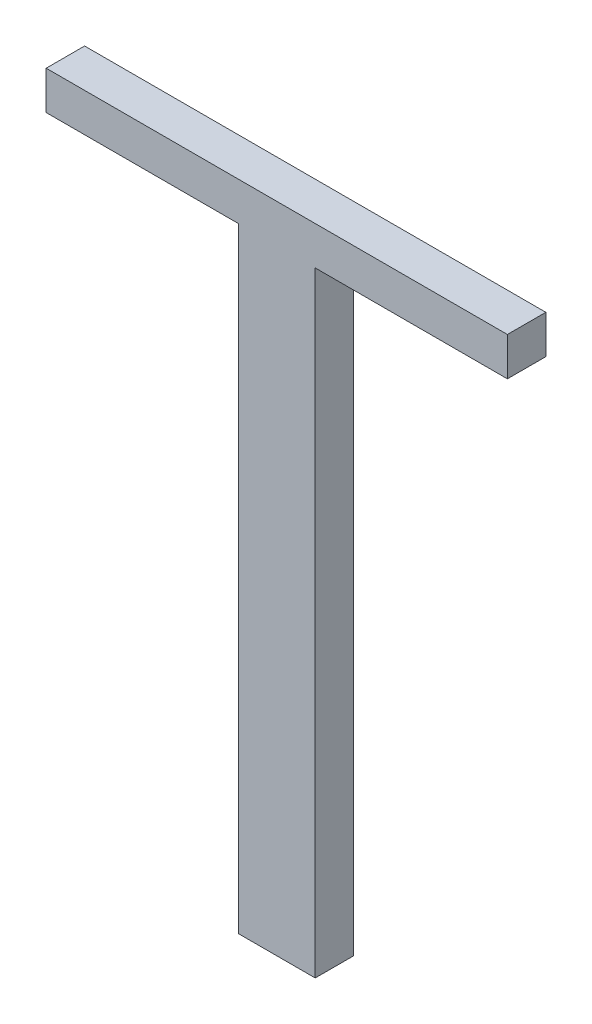
ISO-10303-21;
HEADER;
FILE_DESCRIPTION(('STEP AP214'),'2;1');
FILE_NAME('part.step','',(''),(''),'','','');
FILE_SCHEMA(('AUTOMOTIVE_DESIGN { 1 0 10303 214 1 1 1 1 }'));
ENDSEC;
DATA;
#1=APPLICATION_CONTEXT('core data for automotive mechanical design processes');
#2=APPLICATION_PROTOCOL_DEFINITION('international standard','automotive_design',2000,#1);
#3=PRODUCT_CONTEXT('',#1,'mechanical');
#4=PRODUCT('Part','Part','',(#3));
#5=PRODUCT_RELATED_PRODUCT_CATEGORY('part','',(#4));
#6=PRODUCT_DEFINITION_FORMATION('','',#4);
#7=PRODUCT_DEFINITION_CONTEXT('part definition',#1,'design');
#8=PRODUCT_DEFINITION('design','',#6,#7);
#9=PRODUCT_DEFINITION_SHAPE('','',#8);
#10=(LENGTH_UNIT() NAMED_UNIT(*) SI_UNIT(.MILLI.,.METRE.));
#11=(NAMED_UNIT(*) PLANE_ANGLE_UNIT() SI_UNIT($,.RADIAN.));
#12=(NAMED_UNIT(*) SI_UNIT($,.STERADIAN.) SOLID_ANGLE_UNIT());
#13=UNCERTAINTY_MEASURE_WITH_UNIT(LENGTH_MEASURE(1.E-05),#10,'distance_accuracy_value','');
#14=(GEOMETRIC_REPRESENTATION_CONTEXT(3) GLOBAL_UNCERTAINTY_ASSIGNED_CONTEXT((#13)) GLOBAL_UNIT_ASSIGNED_CONTEXT((#10,
#11,#12)) REPRESENTATION_CONTEXT('',''));
#15=CARTESIAN_POINT('',(0.,0.,0.));
#16=DIRECTION('',(0.,0.,1.));
#17=DIRECTION('',(1.,0.,0.));
#18=AXIS2_PLACEMENT_3D('',#15,#16,#17);
#19=CARTESIAN_POINT('',(0.,0.,5.));
#20=DIRECTION('',(1.,0.,0.));
#21=DIRECTION('',(0.,0.,-1.));
#22=AXIS2_PLACEMENT_3D('',#19,#20,#21);
#23=PLANE('',#22);
#24=DIRECTION('',(0.,-1.,0.));
#25=VECTOR('',#24,1.);
#26=CARTESIAN_POINT('',(0.,0.,0.));
#27=LINE('',#26,#25);
#28=CARTESIAN_POINT('',(0.,80.,0.));
#29=VERTEX_POINT('',#28);
#30=CARTESIAN_POINT('',(0.,0.,0.));
#31=VERTEX_POINT('',#30);
#32=EDGE_CURVE('E140',#29,#31,#27,.T.);
#33=ORIENTED_EDGE('',*,*,#32,.T.);
#34=DIRECTION('',(0.,0.,-1.));
#35=VECTOR('',#34,1.);
#36=CARTESIAN_POINT('',(0.,0.,5.));
#37=LINE('',#36,#35);
#38=CARTESIAN_POINT('',(0.,0.,5.));
#39=VERTEX_POINT('',#38);
#40=EDGE_CURVE('E11',#39,#31,#37,.T.);
#41=ORIENTED_EDGE('',*,*,#40,.F.);
#42=DIRECTION('',(0.,-1.,0.));
#43=VECTOR('',#42,1.);
#44=CARTESIAN_POINT('',(0.,0.,5.));
#45=LINE('',#44,#43);
#46=CARTESIAN_POINT('',(0.,80.,5.));
#47=VERTEX_POINT('',#46);
#48=EDGE_CURVE('E162',#47,#39,#45,.T.);
#49=ORIENTED_EDGE('',*,*,#48,.F.);
#50=DIRECTION('',(0.,0.,-1.));
#51=VECTOR('',#50,1.);
#52=CARTESIAN_POINT('',(0.,80.,5.));
#53=LINE('',#52,#51);
#54=EDGE_CURVE('E136',#47,#29,#53,.T.);
#55=ORIENTED_EDGE('',*,*,#54,.T.);
#56=EDGE_LOOP('',(#33,#41,#49,#55));
#57=FACE_BOUND('',#56,.T.);
#58=ADVANCED_FACE('F39',(#57),#23,.F.);
#59=CARTESIAN_POINT('',(0.,0.,5.));
#60=DIRECTION('',(0.,1.,0.));
#61=DIRECTION('',(0.,0.,1.));
#62=AXIS2_PLACEMENT_3D('',#59,#60,#61);
#63=PLANE('',#62);
#64=DIRECTION('',(1.,0.,0.));
#65=VECTOR('',#64,1.);
#66=CARTESIAN_POINT('',(0.,0.,0.));
#67=LINE('',#66,#65);
#68=CARTESIAN_POINT('',(10.,0.,0.));
#69=VERTEX_POINT('',#68);
#70=EDGE_CURVE('E144',#31,#69,#67,.T.);
#71=ORIENTED_EDGE('',*,*,#70,.T.);
#72=DIRECTION('',(0.,0.,-1.));
#73=VECTOR('',#72,1.);
#74=CARTESIAN_POINT('',(10.,0.,5.));
#75=LINE('',#74,#73);
#76=CARTESIAN_POINT('',(10.,0.,5.));
#77=VERTEX_POINT('',#76);
#78=EDGE_CURVE('E48',#77,#69,#75,.T.);
#79=ORIENTED_EDGE('',*,*,#78,.F.);
#80=DIRECTION('',(1.,0.,0.));
#81=VECTOR('',#80,1.);
#82=CARTESIAN_POINT('',(0.,0.,5.));
#83=LINE('',#82,#81);
#84=EDGE_CURVE('E99',#39,#77,#83,.T.);
#85=ORIENTED_EDGE('',*,*,#84,.F.);
#86=ORIENTED_EDGE('',*,*,#40,.T.);
#87=EDGE_LOOP('',(#71,#79,#85,#86));
#88=FACE_BOUND('',#87,.T.);
#89=ADVANCED_FACE('F208',(#88),#63,.F.);
#90=CARTESIAN_POINT('',(10.,0.,5.));
#91=DIRECTION('',(-1.,0.,0.));
#92=DIRECTION('',(0.,0.,1.));
#93=AXIS2_PLACEMENT_3D('',#90,#91,#92);
#94=PLANE('',#93);
#95=DIRECTION('',(0.,1.,0.));
#96=VECTOR('',#95,1.);
#97=CARTESIAN_POINT('',(10.,0.,0.));
#98=LINE('',#97,#96);
#99=CARTESIAN_POINT('',(10.,80.,0.));
#100=VERTEX_POINT('',#99);
#101=EDGE_CURVE('E147',#69,#100,#98,.T.);
#102=ORIENTED_EDGE('',*,*,#101,.T.);
#103=DIRECTION('',(0.,0.,-1.));
#104=VECTOR('',#103,1.);
#105=CARTESIAN_POINT('',(10.,80.,5.));
#106=LINE('',#105,#104);
#107=CARTESIAN_POINT('',(10.,80.,5.));
#108=VERTEX_POINT('',#107);
#109=EDGE_CURVE('E173',#108,#100,#106,.T.);
#110=ORIENTED_EDGE('',*,*,#109,.F.);
#111=DIRECTION('',(0.,1.,0.));
#112=VECTOR('',#111,1.);
#113=CARTESIAN_POINT('',(10.,0.,5.));
#114=LINE('',#113,#112);
#115=EDGE_CURVE('E183',#77,#108,#114,.T.);
#116=ORIENTED_EDGE('',*,*,#115,.F.);
#117=ORIENTED_EDGE('',*,*,#78,.T.);
#118=EDGE_LOOP('',(#102,#110,#116,#117));
#119=FACE_BOUND('',#118,.T.);
#120=ADVANCED_FACE('F181',(#119),#94,.F.);
#121=CARTESIAN_POINT('',(10.,80.,5.));
#122=DIRECTION('',(0.,1.,0.));
#123=DIRECTION('',(0.,0.,1.));
#124=AXIS2_PLACEMENT_3D('',#121,#122,#123);
#125=PLANE('',#124);
#126=DIRECTION('',(1.,0.,0.));
#127=VECTOR('',#126,1.);
#128=CARTESIAN_POINT('',(10.,80.,0.));
#129=LINE('',#128,#127);
#130=CARTESIAN_POINT('',(35.,80.,0.));
#131=VERTEX_POINT('',#130);
#132=EDGE_CURVE('E150',#100,#131,#129,.T.);
#133=ORIENTED_EDGE('',*,*,#132,.T.);
#134=DIRECTION('',(0.,0.,-1.));
#135=VECTOR('',#134,1.);
#136=CARTESIAN_POINT('',(35.,80.,5.));
#137=LINE('',#136,#135);
#138=CARTESIAN_POINT('',(35.,80.,5.));
#139=VERTEX_POINT('',#138);
#140=EDGE_CURVE('E169',#139,#131,#137,.T.);
#141=ORIENTED_EDGE('',*,*,#140,.F.);
#142=DIRECTION('',(1.,0.,0.));
#143=VECTOR('',#142,1.);
#144=CARTESIAN_POINT('',(10.,80.,5.));
#145=LINE('',#144,#143);
#146=EDGE_CURVE('E196',#108,#139,#145,.T.);
#147=ORIENTED_EDGE('',*,*,#146,.F.);
#148=ORIENTED_EDGE('',*,*,#109,.T.);
#149=EDGE_LOOP('',(#133,#141,#147,#148));
#150=FACE_BOUND('',#149,.T.);
#151=ADVANCED_FACE('F191',(#150),#125,.F.);
#152=CARTESIAN_POINT('',(35.,80.,5.));
#153=DIRECTION('',(-1.,0.,0.));
#154=DIRECTION('',(0.,0.,1.));
#155=AXIS2_PLACEMENT_3D('',#152,#153,#154);
#156=PLANE('',#155);
#157=DIRECTION('',(0.,1.,0.));
#158=VECTOR('',#157,1.);
#159=CARTESIAN_POINT('',(35.,80.,0.));
#160=LINE('',#159,#158);
#161=CARTESIAN_POINT('',(35.,85.,0.));
#162=VERTEX_POINT('',#161);
#163=EDGE_CURVE('E153',#131,#162,#160,.T.);
#164=ORIENTED_EDGE('',*,*,#163,.T.);
#165=DIRECTION('',(0.,0.,-1.));
#166=VECTOR('',#165,1.);
#167=CARTESIAN_POINT('',(35.,85.,5.));
#168=LINE('',#167,#166);
#169=CARTESIAN_POINT('',(35.,85.,5.));
#170=VERTEX_POINT('',#169);
#171=EDGE_CURVE('E129',#170,#162,#168,.T.);
#172=ORIENTED_EDGE('',*,*,#171,.F.);
#173=DIRECTION('',(0.,1.,0.));
#174=VECTOR('',#173,1.);
#175=CARTESIAN_POINT('',(35.,80.,5.));
#176=LINE('',#175,#174);
#177=EDGE_CURVE('E118',#139,#170,#176,.T.);
#178=ORIENTED_EDGE('',*,*,#177,.F.);
#179=ORIENTED_EDGE('',*,*,#140,.T.);
#180=EDGE_LOOP('',(#164,#172,#178,#179));
#181=FACE_BOUND('',#180,.T.);
#182=ADVANCED_FACE('F194',(#181),#156,.F.);
#183=CARTESIAN_POINT('',(-25.,85.,5.));
#184=DIRECTION('',(0.,-1.,0.));
#185=DIRECTION('',(0.,0.,-1.));
#186=AXIS2_PLACEMENT_3D('',#183,#184,#185);
#187=PLANE('',#186);
#188=DIRECTION('',(-1.,0.,0.));
#189=VECTOR('',#188,1.);
#190=CARTESIAN_POINT('',(-25.,85.,0.));
#191=LINE('',#190,#189);
#192=CARTESIAN_POINT('',(-25.,85.,0.));
#193=VERTEX_POINT('',#192);
#194=EDGE_CURVE('E127',#162,#193,#191,.T.);
#195=ORIENTED_EDGE('',*,*,#194,.T.);
#196=DIRECTION('',(0.,0.,-1.));
#197=VECTOR('',#196,1.);
#198=CARTESIAN_POINT('',(-25.,85.,5.));
#199=LINE('',#198,#197);
#200=CARTESIAN_POINT('',(-25.,85.,5.));
#201=VERTEX_POINT('',#200);
#202=EDGE_CURVE('E124',#201,#193,#199,.T.);
#203=ORIENTED_EDGE('',*,*,#202,.F.);
#204=DIRECTION('',(-1.,0.,0.));
#205=VECTOR('',#204,1.);
#206=CARTESIAN_POINT('',(-25.,85.,5.));
#207=LINE('',#206,#205);
#208=EDGE_CURVE('E112',#170,#201,#207,.T.);
#209=ORIENTED_EDGE('',*,*,#208,.F.);
#210=ORIENTED_EDGE('',*,*,#171,.T.);
#211=EDGE_LOOP('',(#195,#203,#209,#210));
#212=FACE_BOUND('',#211,.T.);
#213=ADVANCED_FACE('F125',(#212),#187,.F.);
#214=CARTESIAN_POINT('',(-25.,80.,5.));
#215=DIRECTION('',(1.,0.,0.));
#216=DIRECTION('',(0.,1.,0.));
#217=AXIS2_PLACEMENT_3D('',#214,#215,#216);
#218=PLANE('',#217);
#219=DIRECTION('',(0.,-1.,0.));
#220=VECTOR('',#219,1.);
#221=CARTESIAN_POINT('',(-25.,80.,0.));
#222=LINE('',#221,#220);
#223=CARTESIAN_POINT('',(-25.,80.,0.));
#224=VERTEX_POINT('',#223);
#225=EDGE_CURVE('E85',#193,#224,#222,.T.);
#226=ORIENTED_EDGE('',*,*,#225,.T.);
#227=DIRECTION('',(0.,0.,-1.));
#228=VECTOR('',#227,1.);
#229=CARTESIAN_POINT('',(-25.,80.,5.));
#230=LINE('',#229,#228);
#231=CARTESIAN_POINT('',(-25.,80.,5.));
#232=VERTEX_POINT('',#231);
#233=EDGE_CURVE('E130',#232,#224,#230,.T.);
#234=ORIENTED_EDGE('',*,*,#233,.F.);
#235=DIRECTION('',(0.,-1.,0.));
#236=VECTOR('',#235,1.);
#237=CARTESIAN_POINT('',(-25.,80.,5.));
#238=LINE('',#237,#236);
#239=EDGE_CURVE('E116',#201,#232,#238,.T.);
#240=ORIENTED_EDGE('',*,*,#239,.F.);
#241=ORIENTED_EDGE('',*,*,#202,.T.);
#242=EDGE_LOOP('',(#226,#234,#240,#241));
#243=FACE_BOUND('',#242,.T.);
#244=ADVANCED_FACE('F132',(#243),#218,.F.);
#245=CARTESIAN_POINT('',(-25.,80.,5.));
#246=DIRECTION('',(0.,1.,0.));
#247=DIRECTION('',(0.,0.,1.));
#248=AXIS2_PLACEMENT_3D('',#245,#246,#247);
#249=PLANE('',#248);
#250=DIRECTION('',(1.,0.,0.));
#251=VECTOR('',#250,1.);
#252=CARTESIAN_POINT('',(-25.,80.,0.));
#253=LINE('',#252,#251);
#254=EDGE_CURVE('E91',#224,#29,#253,.T.);
#255=ORIENTED_EDGE('',*,*,#254,.T.);
#256=ORIENTED_EDGE('',*,*,#54,.F.);
#257=DIRECTION('',(1.,0.,0.));
#258=VECTOR('',#257,1.);
#259=CARTESIAN_POINT('',(-25.,80.,5.));
#260=LINE('',#259,#258);
#261=EDGE_CURVE('E56',#232,#47,#260,.T.);
#262=ORIENTED_EDGE('',*,*,#261,.F.);
#263=ORIENTED_EDGE('',*,*,#233,.T.);
#264=EDGE_LOOP('',(#255,#256,#262,#263));
#265=FACE_BOUND('',#264,.T.);
#266=ADVANCED_FACE('F224',(#265),#249,.F.);
#267=CARTESIAN_POINT('',(0.,0.,5.));
#268=DIRECTION('',(0.,0.,-1.));
#269=DIRECTION('',(-1.,0.,0.));
#270=AXIS2_PLACEMENT_3D('',#267,#268,#269);
#271=PLANE('',#270);
#272=ORIENTED_EDGE('',*,*,#48,.T.);
#273=ORIENTED_EDGE('',*,*,#84,.T.);
#274=ORIENTED_EDGE('',*,*,#115,.T.);
#275=ORIENTED_EDGE('',*,*,#146,.T.);
#276=ORIENTED_EDGE('',*,*,#177,.T.);
#277=ORIENTED_EDGE('',*,*,#208,.T.);
#278=ORIENTED_EDGE('',*,*,#239,.T.);
#279=ORIENTED_EDGE('',*,*,#261,.T.);
#280=EDGE_LOOP('',(#272,#273,#274,#275,#276,#277,#278,#279));
#281=FACE_BOUND('',#280,.T.);
#282=ADVANCED_FACE('F114',(#281),#271,.F.);
#283=CARTESIAN_POINT('',(0.,0.,0.));
#284=DIRECTION('',(0.,0.,-1.));
#285=DIRECTION('',(-1.,0.,0.));
#286=AXIS2_PLACEMENT_3D('',#283,#284,#285);
#287=PLANE('',#286);
#288=ORIENTED_EDGE('',*,*,#32,.F.);
#289=ORIENTED_EDGE('',*,*,#254,.F.);
#290=ORIENTED_EDGE('',*,*,#225,.F.);
#291=ORIENTED_EDGE('',*,*,#194,.F.);
#292=ORIENTED_EDGE('',*,*,#163,.F.);
#293=ORIENTED_EDGE('',*,*,#132,.F.);
#294=ORIENTED_EDGE('',*,*,#101,.F.);
#295=ORIENTED_EDGE('',*,*,#70,.F.);
#296=EDGE_LOOP('',(#288,#289,#290,#291,#292,#293,#294,#295));
#297=FACE_BOUND('',#296,.T.);
#298=ADVANCED_FACE('F187',(#297),#287,.T.);
#299=CLOSED_SHELL('',(#58,#89,#120,#151,#182,#213,#244,#266,#282,#298));
#300=MANIFOLD_SOLID_BREP('B2',#299);
#301=ADVANCED_BREP_SHAPE_REPRESENTATION('',(#18,#300),#14);
#302=SHAPE_DEFINITION_REPRESENTATION(#9,#301);
ENDSEC;
END-ISO-10303-21;
